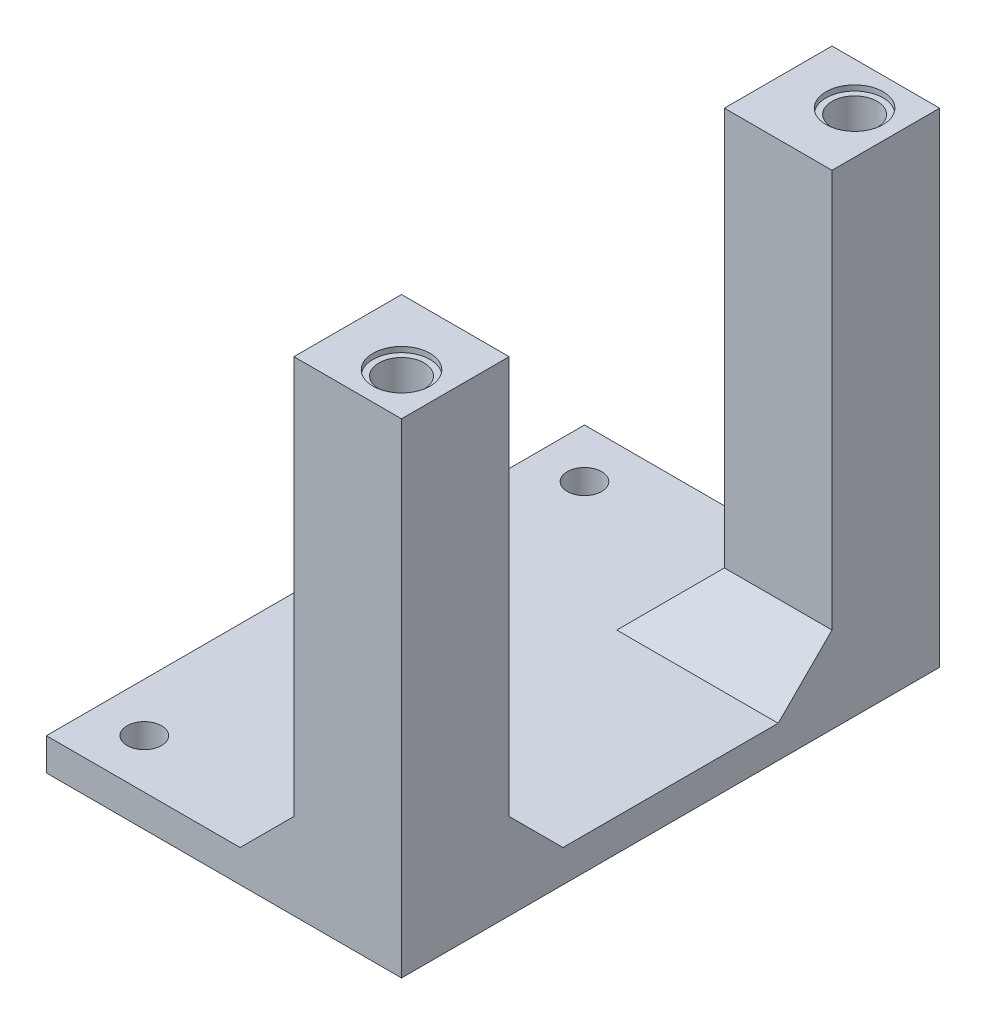
ISO-10303-21;
HEADER;
FILE_DESCRIPTION(('STEP AP214'),'2;1');
FILE_NAME('part.step','',(''),(''),'','','');
FILE_SCHEMA(('AUTOMOTIVE_DESIGN { 1 0 10303 214 1 1 1 1 }'));
ENDSEC;
DATA;
#1=APPLICATION_CONTEXT('core data for automotive mechanical design processes');
#2=APPLICATION_PROTOCOL_DEFINITION('international standard','automotive_design',2000,#1);
#3=PRODUCT_CONTEXT('',#1,'mechanical');
#4=PRODUCT('Part','Part','',(#3));
#5=PRODUCT_RELATED_PRODUCT_CATEGORY('part','',(#4));
#6=PRODUCT_DEFINITION_FORMATION('','',#4);
#7=PRODUCT_DEFINITION_CONTEXT('part definition',#1,'design');
#8=PRODUCT_DEFINITION('design','',#6,#7);
#9=PRODUCT_DEFINITION_SHAPE('','',#8);
#10=(LENGTH_UNIT() NAMED_UNIT(*) SI_UNIT(.MILLI.,.METRE.));
#11=(NAMED_UNIT(*) PLANE_ANGLE_UNIT() SI_UNIT($,.RADIAN.));
#12=(NAMED_UNIT(*) SI_UNIT($,.STERADIAN.) SOLID_ANGLE_UNIT());
#13=UNCERTAINTY_MEASURE_WITH_UNIT(LENGTH_MEASURE(1.E-05),#10,'distance_accuracy_value','');
#14=(GEOMETRIC_REPRESENTATION_CONTEXT(3) GLOBAL_UNCERTAINTY_ASSIGNED_CONTEXT((#13)) GLOBAL_UNIT_ASSIGNED_CONTEXT((#10,
#11,#12)) REPRESENTATION_CONTEXT('',''));
#15=CARTESIAN_POINT('',(0.,0.,0.));
#16=DIRECTION('',(0.,0.,1.));
#17=DIRECTION('',(1.,0.,0.));
#18=AXIS2_PLACEMENT_3D('',#15,#16,#17);
#19=CARTESIAN_POINT('',(22.5376033057851,-7.,-5.73595041322314));
#20=DIRECTION('',(0.,1.,0.));
#21=DIRECTION('',(0.,0.,1.));
#22=AXIS2_PLACEMENT_3D('',#19,#20,#21);
#23=CYLINDRICAL_SURFACE('',#22,2.1);
#24=CARTESIAN_POINT('',(22.5376033057851,44.5,-5.73595041322314));
#25=DIRECTION('',(0.,1.,0.));
#26=DIRECTION('',(0.,0.,1.));
#27=AXIS2_PLACEMENT_3D('',#24,#25,#26);
#28=CIRCLE('',#27,2.1);
#29=CARTESIAN_POINT('',(22.5376033057851,44.5,-3.63595041322314));
#30=VERTEX_POINT('',#29);
#31=EDGE_CURVE('E297',#30,#30,#28,.F.);
#32=ORIENTED_EDGE('',*,*,#31,.F.);
#33=EDGE_LOOP('',(#32));
#34=FACE_BOUND('',#33,.T.);
#35=CARTESIAN_POINT('',(22.5376033057851,0.5,-5.73595041322314));
#36=DIRECTION('',(0.,-1.,0.));
#37=DIRECTION('',(0.,0.,-1.));
#38=AXIS2_PLACEMENT_3D('',#35,#36,#37);
#39=CIRCLE('',#38,2.1);
#40=CARTESIAN_POINT('',(22.5376033057851,0.5,-7.83595041322314));
#41=VERTEX_POINT('',#40);
#42=EDGE_CURVE('E84',#41,#41,#39,.F.);
#43=ORIENTED_EDGE('',*,*,#42,.F.);
#44=EDGE_LOOP('',(#43));
#45=FACE_BOUND('',#44,.T.);
#46=ADVANCED_FACE('F79',(#34,#45),#23,.F.);
#47=CARTESIAN_POINT('',(22.5376033057851,-7.,36.3640495867769));
#48=DIRECTION('',(0.,1.,0.));
#49=DIRECTION('',(0.,0.,1.));
#50=AXIS2_PLACEMENT_3D('',#47,#48,#49);
#51=CYLINDRICAL_SURFACE('',#50,2.1);
#52=CARTESIAN_POINT('',(22.5376033057851,44.5,36.3640495867769));
#53=DIRECTION('',(0.,1.,0.));
#54=DIRECTION('',(0.,0.,1.));
#55=AXIS2_PLACEMENT_3D('',#52,#53,#54);
#56=CIRCLE('',#55,2.1);
#57=CARTESIAN_POINT('',(22.5376033057851,44.5,38.4640495867769));
#58=VERTEX_POINT('',#57);
#59=EDGE_CURVE('E298',#58,#58,#56,.F.);
#60=ORIENTED_EDGE('',*,*,#59,.F.);
#61=EDGE_LOOP('',(#60));
#62=FACE_BOUND('',#61,.T.);
#63=CARTESIAN_POINT('',(22.5376033057851,0.5,36.3640495867769));
#64=DIRECTION('',(0.,-1.,0.));
#65=DIRECTION('',(0.,0.,-1.));
#66=AXIS2_PLACEMENT_3D('',#63,#64,#65);
#67=CIRCLE('',#66,2.1);
#68=CARTESIAN_POINT('',(22.5376033057851,0.5,34.2640495867769));
#69=VERTEX_POINT('',#68);
#70=EDGE_CURVE('E303',#69,#69,#67,.F.);
#71=ORIENTED_EDGE('',*,*,#70,.F.);
#72=EDGE_LOOP('',(#71));
#73=FACE_BOUND('',#72,.T.);
#74=ADVANCED_FACE('F352',(#62,#73),#51,.F.);
#75=CARTESIAN_POINT('',(0.,3.,0.));
#76=DIRECTION('',(0.,-1.,0.));
#77=DIRECTION('',(0.,0.,-1.));
#78=AXIS2_PLACEMENT_3D('',#75,#76,#77);
#79=PLANE('',#78);
#80=CARTESIAN_POINT('',(-1.96239669421488,3.,-5.13595041322314));
#81=DIRECTION('',(0.,1.,0.));
#82=DIRECTION('',(0.,0.,1.));
#83=AXIS2_PLACEMENT_3D('',#80,#81,#82);
#84=CIRCLE('',#83,1.6);
#85=CARTESIAN_POINT('',(-1.96239669421488,3.,-3.53595041322314));
#86=VERTEX_POINT('',#85);
#87=EDGE_CURVE('E244',#86,#86,#84,.T.);
#88=ORIENTED_EDGE('',*,*,#87,.F.);
#89=EDGE_LOOP('',(#88));
#90=FACE_BOUND('',#89,.T.);
#91=CARTESIAN_POINT('',(-1.96239669421487,3.,35.7640495867769));
#92=DIRECTION('',(0.,1.,0.));
#93=DIRECTION('',(0.,0.,1.));
#94=AXIS2_PLACEMENT_3D('',#91,#92,#93);
#95=CIRCLE('',#94,1.6);
#96=CARTESIAN_POINT('',(-1.96239669421487,3.,37.3640495867769));
#97=VERTEX_POINT('',#96);
#98=EDGE_CURVE('E238',#97,#97,#95,.T.);
#99=ORIENTED_EDGE('',*,*,#98,.F.);
#100=EDGE_LOOP('',(#99));
#101=FACE_BOUND('',#100,.T.);
#102=DIRECTION('',(-1.,0.,0.));
#103=VECTOR('',#102,1.);
#104=CARTESIAN_POINT('',(16.4876033057851,3.,5.31404958677684));
#105=LINE('',#104,#103);
#106=CARTESIAN_POINT('',(26.4876033057851,3.,5.31404958677684));
#107=VERTEX_POINT('',#106);
#108=CARTESIAN_POINT('',(11.4876033057851,3.,5.31404958677685));
#109=VERTEX_POINT('',#108);
#110=EDGE_CURVE('E280',#107,#109,#105,.T.);
#111=ORIENTED_EDGE('',*,*,#110,.T.);
#112=DIRECTION('',(0.,0.,-1.));
#113=VECTOR('',#112,1.);
#114=CARTESIAN_POINT('',(11.4876033057851,3.,-9.68595041322314));
#115=LINE('',#114,#113);
#116=CARTESIAN_POINT('',(11.4876033057851,3.,-9.68595041322314));
#117=VERTEX_POINT('',#116);
#118=EDGE_CURVE('E282',#109,#117,#115,.T.);
#119=ORIENTED_EDGE('',*,*,#118,.T.);
#120=DIRECTION('',(1.,0.,0.));
#121=VECTOR('',#120,1.);
#122=CARTESIAN_POINT('',(-6.51239669421488,3.,-9.68595041322314));
#123=LINE('',#122,#121);
#124=CARTESIAN_POINT('',(-6.51239669421488,3.,-9.68595041322314));
#125=VERTEX_POINT('',#124);
#126=EDGE_CURVE('E250',#125,#117,#123,.T.);
#127=ORIENTED_EDGE('',*,*,#126,.F.);
#128=DIRECTION('',(0.,0.,1.));
#129=VECTOR('',#128,1.);
#130=CARTESIAN_POINT('',(-6.51239669421488,3.,-9.68595041322314));
#131=LINE('',#130,#129);
#132=CARTESIAN_POINT('',(-6.51239669421487,3.,40.3140495867769));
#133=VERTEX_POINT('',#132);
#134=EDGE_CURVE('E189',#125,#133,#131,.T.);
#135=ORIENTED_EDGE('',*,*,#134,.T.);
#136=DIRECTION('',(1.,0.,0.));
#137=VECTOR('',#136,1.);
#138=CARTESIAN_POINT('',(1.48760330578513,3.,40.3140495867769));
#139=LINE('',#138,#137);
#140=CARTESIAN_POINT('',(11.4876033057852,3.,40.3140495867769));
#141=VERTEX_POINT('',#140);
#142=EDGE_CURVE('E256',#133,#141,#139,.T.);
#143=ORIENTED_EDGE('',*,*,#142,.T.);
#144=DIRECTION('',(0.,0.,-1.));
#145=VECTOR('',#144,1.);
#146=CARTESIAN_POINT('',(11.4876033057852,3.,30.3140495867769));
#147=LINE('',#146,#145);
#148=CARTESIAN_POINT('',(11.4876033057852,3.,25.3140495867769));
#149=VERTEX_POINT('',#148);
#150=EDGE_CURVE('E278',#141,#149,#147,.T.);
#151=ORIENTED_EDGE('',*,*,#150,.T.);
#152=DIRECTION('',(1.,0.,0.));
#153=VECTOR('',#152,1.);
#154=CARTESIAN_POINT('',(26.4876033057851,3.,25.3140495867769));
#155=LINE('',#154,#153);
#156=CARTESIAN_POINT('',(26.4876033057851,3.,25.3140495867769));
#157=VERTEX_POINT('',#156);
#158=EDGE_CURVE('E276',#149,#157,#155,.T.);
#159=ORIENTED_EDGE('',*,*,#158,.T.);
#160=DIRECTION('',(0.,0.,1.));
#161=VECTOR('',#160,1.);
#162=CARTESIAN_POINT('',(26.4876033057851,3.,-9.68595041322314));
#163=LINE('',#162,#161);
#164=EDGE_CURVE('E253',#107,#157,#163,.T.);
#165=ORIENTED_EDGE('',*,*,#164,.F.);
#166=EDGE_LOOP('',(#111,#119,#127,#135,#143,#151,#159,#165));
#167=FACE_BOUND('',#166,.T.);
#168=ADVANCED_FACE('F357',(#90,#101,#167),#79,.F.);
#169=CARTESIAN_POINT('',(0.,0.,0.));
#170=DIRECTION('',(0.,-1.,0.));
#171=DIRECTION('',(0.,0.,-1.));
#172=AXIS2_PLACEMENT_3D('',#169,#170,#171);
#173=PLANE('',#172);
#174=CARTESIAN_POINT('',(22.5376033057851,0.,36.3640495867769));
#175=DIRECTION('',(0.,1.,0.));
#176=DIRECTION('',(0.,0.,1.));
#177=AXIS2_PLACEMENT_3D('',#174,#175,#176);
#178=CIRCLE('',#177,2.65);
#179=CARTESIAN_POINT('',(22.5376033057851,0.,39.0140495867769));
#180=VERTEX_POINT('',#179);
#181=EDGE_CURVE('E310',#180,#180,#178,.T.);
#182=ORIENTED_EDGE('',*,*,#181,.T.);
#183=EDGE_LOOP('',(#182));
#184=FACE_BOUND('',#183,.T.);
#185=CARTESIAN_POINT('',(22.5376033057851,0.,-5.73595041322314));
#186=DIRECTION('',(0.,1.,0.));
#187=DIRECTION('',(0.,0.,1.));
#188=AXIS2_PLACEMENT_3D('',#185,#186,#187);
#189=CIRCLE('',#188,2.65);
#190=CARTESIAN_POINT('',(22.5376033057851,0.,-3.08595041322314));
#191=VERTEX_POINT('',#190);
#192=EDGE_CURVE('E320',#191,#191,#189,.T.);
#193=ORIENTED_EDGE('',*,*,#192,.T.);
#194=EDGE_LOOP('',(#193));
#195=FACE_BOUND('',#194,.T.);
#196=CARTESIAN_POINT('',(-1.96239669421488,0.,-5.13595041322314));
#197=DIRECTION('',(0.,1.,0.));
#198=DIRECTION('',(0.,0.,1.));
#199=AXIS2_PLACEMENT_3D('',#196,#197,#198);
#200=CIRCLE('',#199,1.6);
#201=CARTESIAN_POINT('',(-1.96239669421488,0.,-3.53595041322314));
#202=VERTEX_POINT('',#201);
#203=EDGE_CURVE('E241',#202,#202,#200,.T.);
#204=ORIENTED_EDGE('',*,*,#203,.T.);
#205=EDGE_LOOP('',(#204));
#206=FACE_BOUND('',#205,.T.);
#207=DIRECTION('',(0.,0.,1.));
#208=VECTOR('',#207,1.);
#209=CARTESIAN_POINT('',(-6.51239669421488,0.,-9.68595041322314));
#210=LINE('',#209,#208);
#211=CARTESIAN_POINT('',(-6.51239669421488,0.,-9.68595041322314));
#212=VERTEX_POINT('',#211);
#213=CARTESIAN_POINT('',(-6.51239669421487,0.,40.3140495867769));
#214=VERTEX_POINT('',#213);
#215=EDGE_CURVE('E254',#212,#214,#210,.T.);
#216=ORIENTED_EDGE('',*,*,#215,.F.);
#217=DIRECTION('',(1.,0.,0.));
#218=VECTOR('',#217,1.);
#219=CARTESIAN_POINT('',(1.48760330578512,0.,-9.68595041322314));
#220=LINE('',#219,#218);
#221=CARTESIAN_POINT('',(26.4876033057851,0.,-9.68595041322314));
#222=VERTEX_POINT('',#221);
#223=EDGE_CURVE('E247',#212,#222,#220,.T.);
#224=ORIENTED_EDGE('',*,*,#223,.T.);
#225=DIRECTION('',(0.,0.,1.));
#226=VECTOR('',#225,1.);
#227=CARTESIAN_POINT('',(26.4876033057851,0.,-9.68595041322314));
#228=LINE('',#227,#226);
#229=CARTESIAN_POINT('',(26.4876033057851,0.,40.3140495867769));
#230=VERTEX_POINT('',#229);
#231=EDGE_CURVE('E185',#222,#230,#228,.T.);
#232=ORIENTED_EDGE('',*,*,#231,.T.);
#233=DIRECTION('',(1.,0.,0.));
#234=VECTOR('',#233,1.);
#235=CARTESIAN_POINT('',(-6.51239669421487,0.,40.3140495867769));
#236=LINE('',#235,#234);
#237=EDGE_CURVE('E263',#214,#230,#236,.T.);
#238=ORIENTED_EDGE('',*,*,#237,.F.);
#239=EDGE_LOOP('',(#216,#224,#232,#238));
#240=FACE_BOUND('',#239,.T.);
#241=CARTESIAN_POINT('',(-1.96239669421487,0.,35.7640495867769));
#242=DIRECTION('',(0.,1.,0.));
#243=DIRECTION('',(0.,0.,1.));
#244=AXIS2_PLACEMENT_3D('',#241,#242,#243);
#245=CIRCLE('',#244,1.6);
#246=CARTESIAN_POINT('',(-1.96239669421487,0.,37.3640495867769));
#247=VERTEX_POINT('',#246);
#248=EDGE_CURVE('E237',#247,#247,#245,.T.);
#249=ORIENTED_EDGE('',*,*,#248,.T.);
#250=EDGE_LOOP('',(#249));
#251=FACE_BOUND('',#250,.T.);
#252=ADVANCED_FACE('F559',(#184,#195,#206,#240,#251),#173,.T.);
#253=CARTESIAN_POINT('',(-6.51239669421488,3.,-9.68595041322314));
#254=DIRECTION('',(1.,0.,0.));
#255=DIRECTION('',(0.,0.,-1.));
#256=AXIS2_PLACEMENT_3D('',#253,#254,#255);
#257=PLANE('',#256);
#258=ORIENTED_EDGE('',*,*,#215,.T.);
#259=DIRECTION('',(0.,-1.,0.));
#260=VECTOR('',#259,1.);
#261=CARTESIAN_POINT('',(-6.51239669421487,3.,40.3140495867769));
#262=LINE('',#261,#260);
#263=EDGE_CURVE('E270',#133,#214,#262,.T.);
#264=ORIENTED_EDGE('',*,*,#263,.F.);
#265=ORIENTED_EDGE('',*,*,#134,.F.);
#266=DIRECTION('',(0.,-1.,0.));
#267=VECTOR('',#266,1.);
#268=CARTESIAN_POINT('',(-6.51239669421488,3.,-9.68595041322314));
#269=LINE('',#268,#267);
#270=EDGE_CURVE('E266',#125,#212,#269,.T.);
#271=ORIENTED_EDGE('',*,*,#270,.T.);
#272=EDGE_LOOP('',(#258,#264,#265,#271));
#273=FACE_BOUND('',#272,.T.);
#274=ADVANCED_FACE('F547',(#273),#257,.F.);
#275=CARTESIAN_POINT('',(-6.51239669421487,3.,40.3140495867769));
#276=DIRECTION('',(0.,0.,-1.));
#277=DIRECTION('',(-1.,0.,0.));
#278=AXIS2_PLACEMENT_3D('',#275,#276,#277);
#279=PLANE('',#278);
#280=ORIENTED_EDGE('',*,*,#237,.T.);
#281=DIRECTION('',(0.,-1.,0.));
#282=VECTOR('',#281,1.);
#283=CARTESIAN_POINT('',(26.4876033057851,3.,40.3140495867769));
#284=LINE('',#283,#282);
#285=CARTESIAN_POINT('',(26.4876033057851,45.,40.3140495867769));
#286=VERTEX_POINT('',#285);
#287=EDGE_CURVE('E188',#286,#230,#284,.T.);
#288=ORIENTED_EDGE('',*,*,#287,.F.);
#289=DIRECTION('',(1.,0.,0.));
#290=VECTOR('',#289,1.);
#291=CARTESIAN_POINT('',(26.4876033057851,45.,40.3140495867769));
#292=LINE('',#291,#290);
#293=CARTESIAN_POINT('',(16.4876033057851,45.,40.3140495867769));
#294=VERTEX_POINT('',#293);
#295=EDGE_CURVE('E227',#294,#286,#292,.T.);
#296=ORIENTED_EDGE('',*,*,#295,.F.);
#297=DIRECTION('',(0.,-1.,0.));
#298=VECTOR('',#297,1.);
#299=CARTESIAN_POINT('',(16.4876033057851,45.,40.3140495867769));
#300=LINE('',#299,#298);
#301=CARTESIAN_POINT('',(16.4876033057851,8.00000000000004,40.3140495867769));
#302=VERTEX_POINT('',#301);
#303=EDGE_CURVE('E230',#294,#302,#300,.T.);
#304=ORIENTED_EDGE('',*,*,#303,.T.);
#305=DIRECTION('',(0.707106781186544,0.707106781186551,0.));
#306=VECTOR('',#305,1.);
#307=CARTESIAN_POINT('',(2.48760330578524,-6.00000000000001,40.3140495867769));
#308=LINE('',#307,#306);
#309=EDGE_CURVE('E89',#302,#141,#308,.F.);
#310=ORIENTED_EDGE('',*,*,#309,.T.);
#311=ORIENTED_EDGE('',*,*,#142,.F.);
#312=ORIENTED_EDGE('',*,*,#263,.T.);
#313=EDGE_LOOP('',(#280,#288,#296,#304,#310,#311,#312));
#314=FACE_BOUND('',#313,.T.);
#315=ADVANCED_FACE('F535',(#314),#279,.F.);
#316=CARTESIAN_POINT('',(26.4876033057851,3.,-9.68595041322314));
#317=DIRECTION('',(1.,0.,0.));
#318=DIRECTION('',(0.,0.,-1.));
#319=AXIS2_PLACEMENT_3D('',#316,#317,#318);
#320=PLANE('',#319);
#321=ORIENTED_EDGE('',*,*,#231,.F.);
#322=DIRECTION('',(0.,-1.,0.));
#323=VECTOR('',#322,1.);
#324=CARTESIAN_POINT('',(26.4876033057851,3.,-9.68595041322314));
#325=LINE('',#324,#323);
#326=CARTESIAN_POINT('',(26.4876033057851,45.,-9.68595041322314));
#327=VERTEX_POINT('',#326);
#328=EDGE_CURVE('E177',#327,#222,#325,.T.);
#329=ORIENTED_EDGE('',*,*,#328,.F.);
#330=DIRECTION('',(0.,0.,-1.));
#331=VECTOR('',#330,1.);
#332=CARTESIAN_POINT('',(26.4876033057851,45.,-9.68595041322314));
#333=LINE('',#332,#331);
#334=CARTESIAN_POINT('',(26.4876033057851,45.,0.314049586776862));
#335=VERTEX_POINT('',#334);
#336=EDGE_CURVE('E182',#335,#327,#333,.T.);
#337=ORIENTED_EDGE('',*,*,#336,.F.);
#338=DIRECTION('',(0.,-1.,0.));
#339=VECTOR('',#338,1.);
#340=CARTESIAN_POINT('',(26.4876033057851,45.,0.314049586776862));
#341=LINE('',#340,#339);
#342=CARTESIAN_POINT('',(26.4876033057851,8.00000000000006,0.314049586776862));
#343=VERTEX_POINT('',#342);
#344=EDGE_CURVE('E214',#335,#343,#341,.T.);
#345=ORIENTED_EDGE('',*,*,#344,.T.);
#346=DIRECTION('',(0.,0.707106781186552,-0.707106781186543));
#347=VECTOR('',#346,1.);
#348=CARTESIAN_POINT('',(26.4876033057851,8.00000000000004,0.314049586776862));
#349=LINE('',#348,#347);
#350=EDGE_CURVE('E292',#343,#107,#349,.F.);
#351=ORIENTED_EDGE('',*,*,#350,.T.);
#352=ORIENTED_EDGE('',*,*,#164,.T.);
#353=DIRECTION('',(0.,-0.707106781186551,-0.707106781186544));
#354=VECTOR('',#353,1.);
#355=CARTESIAN_POINT('',(26.4876033057851,8.00000000000003,30.3140495867769));
#356=LINE('',#355,#354);
#357=CARTESIAN_POINT('',(26.4876033057851,8.00000000000004,30.3140495867769));
#358=VERTEX_POINT('',#357);
#359=EDGE_CURVE('E12',#157,#358,#356,.F.);
#360=ORIENTED_EDGE('',*,*,#359,.T.);
#361=DIRECTION('',(0.,-1.,0.));
#362=VECTOR('',#361,1.);
#363=CARTESIAN_POINT('',(26.4876033057851,45.,30.3140495867769));
#364=LINE('',#363,#362);
#365=CARTESIAN_POINT('',(26.4876033057851,45.,30.3140495867769));
#366=VERTEX_POINT('',#365);
#367=EDGE_CURVE('E235',#366,#358,#364,.T.);
#368=ORIENTED_EDGE('',*,*,#367,.F.);
#369=DIRECTION('',(0.,0.,-1.));
#370=VECTOR('',#369,1.);
#371=CARTESIAN_POINT('',(26.4876033057851,45.,40.3140495867769));
#372=LINE('',#371,#370);
#373=EDGE_CURVE('E220',#286,#366,#372,.T.);
#374=ORIENTED_EDGE('',*,*,#373,.F.);
#375=ORIENTED_EDGE('',*,*,#287,.T.);
#376=EDGE_LOOP('',(#321,#329,#337,#345,#351,#352,#360,#368,#374,#375));
#377=FACE_BOUND('',#376,.T.);
#378=ADVANCED_FACE('F179',(#377),#320,.T.);
#379=CARTESIAN_POINT('',(1.48760330578512,3.,-9.68595041322314));
#380=DIRECTION('',(0.,0.,-1.));
#381=DIRECTION('',(-1.,0.,0.));
#382=AXIS2_PLACEMENT_3D('',#379,#380,#381);
#383=PLANE('',#382);
#384=ORIENTED_EDGE('',*,*,#223,.F.);
#385=ORIENTED_EDGE('',*,*,#270,.F.);
#386=ORIENTED_EDGE('',*,*,#126,.T.);
#387=DIRECTION('',(-0.707106781186543,-0.707106781186552,0.));
#388=VECTOR('',#387,1.);
#389=CARTESIAN_POINT('',(16.4876033057851,8.00000000000004,-9.68595041322314));
#390=LINE('',#389,#388);
#391=CARTESIAN_POINT('',(16.4876033057851,8.00000000000006,-9.68595041322314));
#392=VERTEX_POINT('',#391);
#393=EDGE_CURVE('E290',#117,#392,#390,.F.);
#394=ORIENTED_EDGE('',*,*,#393,.T.);
#395=DIRECTION('',(0.,-1.,0.));
#396=VECTOR('',#395,1.);
#397=CARTESIAN_POINT('',(16.4876033057851,45.,-9.68595041322314));
#398=LINE('',#397,#396);
#399=CARTESIAN_POINT('',(16.4876033057851,45.,-9.68595041322314));
#400=VERTEX_POINT('',#399);
#401=EDGE_CURVE('E195',#400,#392,#398,.T.);
#402=ORIENTED_EDGE('',*,*,#401,.F.);
#403=DIRECTION('',(-1.,0.,0.));
#404=VECTOR('',#403,1.);
#405=CARTESIAN_POINT('',(26.4876033057851,45.,-9.68595041322314));
#406=LINE('',#405,#404);
#407=EDGE_CURVE('E192',#327,#400,#406,.T.);
#408=ORIENTED_EDGE('',*,*,#407,.F.);
#409=ORIENTED_EDGE('',*,*,#328,.T.);
#410=EDGE_LOOP('',(#384,#385,#386,#394,#402,#408,#409));
#411=FACE_BOUND('',#410,.T.);
#412=ADVANCED_FACE('F193',(#411),#383,.T.);
#413=CARTESIAN_POINT('',(-1.96239669421488,3.,-5.13595041322314));
#414=DIRECTION('',(0.,-1.,0.));
#415=DIRECTION('',(0.,0.,-1.));
#416=AXIS2_PLACEMENT_3D('',#413,#414,#415);
#417=CYLINDRICAL_SURFACE('',#416,1.6);
#418=ORIENTED_EDGE('',*,*,#87,.T.);
#419=EDGE_LOOP('',(#418));
#420=FACE_BOUND('',#419,.T.);
#421=ORIENTED_EDGE('',*,*,#203,.F.);
#422=EDGE_LOOP('',(#421));
#423=FACE_BOUND('',#422,.T.);
#424=ADVANCED_FACE('F523',(#420,#423),#417,.F.);
#425=CARTESIAN_POINT('',(-1.96239669421487,3.,35.7640495867769));
#426=DIRECTION('',(0.,-1.,0.));
#427=DIRECTION('',(0.,0.,-1.));
#428=AXIS2_PLACEMENT_3D('',#425,#426,#427);
#429=CYLINDRICAL_SURFACE('',#428,1.6);
#430=ORIENTED_EDGE('',*,*,#98,.T.);
#431=EDGE_LOOP('',(#430));
#432=FACE_BOUND('',#431,.T.);
#433=ORIENTED_EDGE('',*,*,#248,.F.);
#434=EDGE_LOOP('',(#433));
#435=FACE_BOUND('',#434,.T.);
#436=ADVANCED_FACE('F514',(#432,#435),#429,.F.);
#437=CARTESIAN_POINT('',(26.4876033057851,45.,30.3140495867769));
#438=DIRECTION('',(0.,0.,1.));
#439=DIRECTION('',(1.,0.,0.));
#440=AXIS2_PLACEMENT_3D('',#437,#438,#439);
#441=PLANE('',#440);
#442=ORIENTED_EDGE('',*,*,#367,.T.);
#443=DIRECTION('',(-1.,0.,0.));
#444=VECTOR('',#443,1.);
#445=CARTESIAN_POINT('',(16.4876033057851,8.00000000000003,30.3140495867769));
#446=LINE('',#445,#444);
#447=CARTESIAN_POINT('',(16.4876033057851,8.00000000000004,30.3140495867769));
#448=VERTEX_POINT('',#447);
#449=EDGE_CURVE('E102',#358,#448,#446,.T.);
#450=ORIENTED_EDGE('',*,*,#449,.T.);
#451=DIRECTION('',(0.,-1.,0.));
#452=VECTOR('',#451,1.);
#453=CARTESIAN_POINT('',(16.4876033057851,45.,30.3140495867769));
#454=LINE('',#453,#452);
#455=CARTESIAN_POINT('',(16.4876033057851,45.,30.3140495867769));
#456=VERTEX_POINT('',#455);
#457=EDGE_CURVE('E233',#456,#448,#454,.T.);
#458=ORIENTED_EDGE('',*,*,#457,.F.);
#459=DIRECTION('',(-1.,0.,0.));
#460=VECTOR('',#459,1.);
#461=CARTESIAN_POINT('',(26.4876033057851,45.,30.3140495867769));
#462=LINE('',#461,#460);
#463=EDGE_CURVE('E223',#366,#456,#462,.T.);
#464=ORIENTED_EDGE('',*,*,#463,.F.);
#465=EDGE_LOOP('',(#442,#450,#458,#464));
#466=FACE_BOUND('',#465,.T.);
#467=ADVANCED_FACE('F505',(#466),#441,.F.);
#468=CARTESIAN_POINT('',(16.4876033057851,45.,40.3140495867769));
#469=DIRECTION('',(1.,0.,0.));
#470=DIRECTION('',(0.,0.,-1.));
#471=AXIS2_PLACEMENT_3D('',#468,#469,#470);
#472=PLANE('',#471);
#473=ORIENTED_EDGE('',*,*,#457,.T.);
#474=DIRECTION('',(0.,0.,1.));
#475=VECTOR('',#474,1.);
#476=CARTESIAN_POINT('',(16.4876033057851,8.00000000000003,40.3140495867769));
#477=LINE('',#476,#475);
#478=EDGE_CURVE('E286',#448,#302,#477,.T.);
#479=ORIENTED_EDGE('',*,*,#478,.T.);
#480=ORIENTED_EDGE('',*,*,#303,.F.);
#481=DIRECTION('',(0.,0.,1.));
#482=VECTOR('',#481,1.);
#483=CARTESIAN_POINT('',(16.4876033057851,45.,40.3140495867769));
#484=LINE('',#483,#482);
#485=EDGE_CURVE('E225',#456,#294,#484,.T.);
#486=ORIENTED_EDGE('',*,*,#485,.F.);
#487=EDGE_LOOP('',(#473,#479,#480,#486));
#488=FACE_BOUND('',#487,.T.);
#489=ADVANCED_FACE('F497',(#488),#472,.F.);
#490=CARTESIAN_POINT('',(0.,45.,0.));
#491=DIRECTION('',(0.,1.,0.));
#492=DIRECTION('',(0.,0.,1.));
#493=AXIS2_PLACEMENT_3D('',#490,#491,#492);
#494=PLANE('',#493);
#495=CARTESIAN_POINT('',(22.5376033057851,45.,36.3640495867769));
#496=DIRECTION('',(0.,1.,0.));
#497=DIRECTION('',(0.,0.,1.));
#498=AXIS2_PLACEMENT_3D('',#495,#496,#497);
#499=CIRCLE('',#498,2.65);
#500=CARTESIAN_POINT('',(22.5376033057851,45.,39.0140495867769));
#501=VERTEX_POINT('',#500);
#502=EDGE_CURVE('E325',#501,#501,#499,.T.);
#503=ORIENTED_EDGE('',*,*,#502,.F.);
#504=EDGE_LOOP('',(#503));
#505=FACE_BOUND('',#504,.T.);
#506=ORIENTED_EDGE('',*,*,#373,.T.);
#507=ORIENTED_EDGE('',*,*,#463,.T.);
#508=ORIENTED_EDGE('',*,*,#485,.T.);
#509=ORIENTED_EDGE('',*,*,#295,.T.);
#510=EDGE_LOOP('',(#506,#507,#508,#509));
#511=FACE_BOUND('',#510,.T.);
#512=ADVANCED_FACE('F488',(#505,#511),#494,.T.);
#513=CARTESIAN_POINT('',(16.4876033057851,45.,-9.68595041322314));
#514=DIRECTION('',(1.,0.,0.));
#515=DIRECTION('',(0.,0.,-1.));
#516=AXIS2_PLACEMENT_3D('',#513,#514,#515);
#517=PLANE('',#516);
#518=ORIENTED_EDGE('',*,*,#401,.T.);
#519=DIRECTION('',(0.,0.,1.));
#520=VECTOR('',#519,1.);
#521=CARTESIAN_POINT('',(16.4876033057851,8.00000000000004,0.314049586776863));
#522=LINE('',#521,#520);
#523=CARTESIAN_POINT('',(16.4876033057851,8.00000000000006,0.314049586776863));
#524=VERTEX_POINT('',#523);
#525=EDGE_CURVE('E269',#392,#524,#522,.T.);
#526=ORIENTED_EDGE('',*,*,#525,.T.);
#527=DIRECTION('',(0.,-1.,0.));
#528=VECTOR('',#527,1.);
#529=CARTESIAN_POINT('',(16.4876033057851,45.,0.314049586776863));
#530=LINE('',#529,#528);
#531=CARTESIAN_POINT('',(16.4876033057851,45.,0.314049586776863));
#532=VERTEX_POINT('',#531);
#533=EDGE_CURVE('E216',#532,#524,#530,.T.);
#534=ORIENTED_EDGE('',*,*,#533,.F.);
#535=DIRECTION('',(0.,0.,1.));
#536=VECTOR('',#535,1.);
#537=CARTESIAN_POINT('',(16.4876033057851,45.,-9.68595041322314));
#538=LINE('',#537,#536);
#539=EDGE_CURVE('E198',#400,#532,#538,.T.);
#540=ORIENTED_EDGE('',*,*,#539,.F.);
#541=EDGE_LOOP('',(#518,#526,#534,#540));
#542=FACE_BOUND('',#541,.T.);
#543=ADVANCED_FACE('F347',(#542),#517,.F.);
#544=CARTESIAN_POINT('',(26.4876033057851,45.,0.314049586776862));
#545=DIRECTION('',(0.,0.,-1.));
#546=DIRECTION('',(-1.,0.,0.));
#547=AXIS2_PLACEMENT_3D('',#544,#545,#546);
#548=PLANE('',#547);
#549=ORIENTED_EDGE('',*,*,#533,.T.);
#550=DIRECTION('',(1.,0.,0.));
#551=VECTOR('',#550,1.);
#552=CARTESIAN_POINT('',(26.4876033057851,8.00000000000004,0.314049586776862));
#553=LINE('',#552,#551);
#554=EDGE_CURVE('E284',#524,#343,#553,.T.);
#555=ORIENTED_EDGE('',*,*,#554,.T.);
#556=ORIENTED_EDGE('',*,*,#344,.F.);
#557=DIRECTION('',(1.,0.,0.));
#558=VECTOR('',#557,1.);
#559=CARTESIAN_POINT('',(26.4876033057851,45.,0.314049586776862));
#560=LINE('',#559,#558);
#561=EDGE_CURVE('E202',#532,#335,#560,.T.);
#562=ORIENTED_EDGE('',*,*,#561,.F.);
#563=EDGE_LOOP('',(#549,#555,#556,#562));
#564=FACE_BOUND('',#563,.T.);
#565=ADVANCED_FACE('F338',(#564),#548,.F.);
#566=CARTESIAN_POINT('',(0.,45.,0.));
#567=DIRECTION('',(0.,-1.,0.));
#568=DIRECTION('',(0.,0.,-1.));
#569=AXIS2_PLACEMENT_3D('',#566,#567,#568);
#570=PLANE('',#569);
#571=CARTESIAN_POINT('',(22.5376033057851,45.,-5.73595041322314));
#572=DIRECTION('',(0.,1.,0.));
#573=DIRECTION('',(0.,0.,1.));
#574=AXIS2_PLACEMENT_3D('',#571,#572,#573);
#575=CIRCLE('',#574,2.65);
#576=CARTESIAN_POINT('',(22.5376033057851,45.,-3.08595041322314));
#577=VERTEX_POINT('',#576);
#578=EDGE_CURVE('E209',#577,#577,#575,.T.);
#579=ORIENTED_EDGE('',*,*,#578,.F.);
#580=EDGE_LOOP('',(#579));
#581=FACE_BOUND('',#580,.T.);
#582=ORIENTED_EDGE('',*,*,#336,.T.);
#583=ORIENTED_EDGE('',*,*,#407,.T.);
#584=ORIENTED_EDGE('',*,*,#539,.T.);
#585=ORIENTED_EDGE('',*,*,#561,.T.);
#586=EDGE_LOOP('',(#582,#583,#584,#585));
#587=FACE_BOUND('',#586,.T.);
#588=ADVANCED_FACE('F200',(#581,#587),#570,.F.);
#589=CARTESIAN_POINT('',(26.4876033057851,8.00000000000004,0.314049586776862));
#590=DIRECTION('',(0.,0.707106781186543,0.707106781186552));
#591=DIRECTION('',(-1.,0.,0.));
#592=AXIS2_PLACEMENT_3D('',#589,#590,#591);
#593=PLANE('',#592);
#594=ORIENTED_EDGE('',*,*,#350,.F.);
#595=ORIENTED_EDGE('',*,*,#554,.F.);
#596=DIRECTION('',(-0.577350269189624,-0.57735026918963,0.577350269189623));
#597=VECTOR('',#596,1.);
#598=CARTESIAN_POINT('',(19.8209366391184,11.3333333333334,-3.01928374655645));
#599=LINE('',#598,#597);
#600=EDGE_CURVE('E204',#109,#524,#599,.F.);
#601=ORIENTED_EDGE('',*,*,#600,.F.);
#602=ORIENTED_EDGE('',*,*,#110,.F.);
#603=EDGE_LOOP('',(#594,#595,#601,#602));
#604=FACE_BOUND('',#603,.T.);
#605=ADVANCED_FACE('F337',(#604),#593,.T.);
#606=CARTESIAN_POINT('',(16.4876033057851,8.00000000000004,-9.68595041322314));
#607=DIRECTION('',(-0.707106781186552,0.707106781186543,0.));
#608=DIRECTION('',(0.,0.,-1.));
#609=AXIS2_PLACEMENT_3D('',#606,#607,#608);
#610=PLANE('',#609);
#611=ORIENTED_EDGE('',*,*,#393,.F.);
#612=ORIENTED_EDGE('',*,*,#118,.F.);
#613=ORIENTED_EDGE('',*,*,#600,.T.);
#614=ORIENTED_EDGE('',*,*,#525,.F.);
#615=EDGE_LOOP('',(#611,#612,#613,#614));
#616=FACE_BOUND('',#615,.T.);
#617=ADVANCED_FACE('F344',(#616),#610,.T.);
#618=CARTESIAN_POINT('',(26.4876033057851,8.00000000000003,30.3140495867769));
#619=DIRECTION('',(0.,0.707106781186544,-0.707106781186551));
#620=DIRECTION('',(1.,0.,0.));
#621=AXIS2_PLACEMENT_3D('',#618,#619,#620);
#622=PLANE('',#621);
#623=ORIENTED_EDGE('',*,*,#359,.F.);
#624=ORIENTED_EDGE('',*,*,#158,.F.);
#625=DIRECTION('',(0.577350269189624,0.57735026918963,0.577350269189624));
#626=VECTOR('',#625,1.);
#627=CARTESIAN_POINT('',(19.8209366391184,11.3333333333334,33.6473829201102));
#628=LINE('',#627,#626);
#629=EDGE_CURVE('E206',#448,#149,#628,.F.);
#630=ORIENTED_EDGE('',*,*,#629,.F.);
#631=ORIENTED_EDGE('',*,*,#449,.F.);
#632=EDGE_LOOP('',(#623,#624,#630,#631));
#633=FACE_BOUND('',#632,.T.);
#634=ADVANCED_FACE('F82',(#633),#622,.T.);
#635=CARTESIAN_POINT('',(16.4876033057851,8.00000000000003,40.3140495867769));
#636=DIRECTION('',(-0.707106781186551,0.707106781186544,0.));
#637=DIRECTION('',(0.,0.,-1.));
#638=AXIS2_PLACEMENT_3D('',#635,#636,#637);
#639=PLANE('',#638);
#640=ORIENTED_EDGE('',*,*,#629,.T.);
#641=ORIENTED_EDGE('',*,*,#150,.F.);
#642=ORIENTED_EDGE('',*,*,#309,.F.);
#643=ORIENTED_EDGE('',*,*,#478,.F.);
#644=EDGE_LOOP('',(#640,#641,#642,#643));
#645=FACE_BOUND('',#644,.T.);
#646=ADVANCED_FACE('F377',(#645),#639,.T.);
#647=CARTESIAN_POINT('',(22.5376033057851,44.5,36.3640495867769));
#648=DIRECTION('',(0.,1.,0.));
#649=DIRECTION('',(0.,0.,1.));
#650=AXIS2_PLACEMENT_3D('',#647,#648,#649);
#651=PLANE('',#650);
#652=CARTESIAN_POINT('',(22.5376033057851,44.5,36.3640495867769));
#653=DIRECTION('',(0.,1.,0.));
#654=DIRECTION('',(0.,0.,1.));
#655=AXIS2_PLACEMENT_3D('',#652,#653,#654);
#656=CIRCLE('',#655,2.65);
#657=CARTESIAN_POINT('',(22.5376033057851,44.5,39.0140495867769));
#658=VERTEX_POINT('',#657);
#659=EDGE_CURVE('E301',#658,#658,#656,.T.);
#660=ORIENTED_EDGE('',*,*,#659,.T.);
#661=EDGE_LOOP('',(#660));
#662=FACE_BOUND('',#661,.T.);
#663=ORIENTED_EDGE('',*,*,#59,.T.);
#664=EDGE_LOOP('',(#663));
#665=FACE_BOUND('',#664,.T.);
#666=ADVANCED_FACE('F373',(#662,#665),#651,.T.);
#667=CARTESIAN_POINT('',(22.5376033057851,44.5,36.3640495867769));
#668=DIRECTION('',(0.,1.,0.));
#669=DIRECTION('',(0.,0.,1.));
#670=AXIS2_PLACEMENT_3D('',#667,#668,#669);
#671=CYLINDRICAL_SURFACE('',#670,2.65);
#672=ORIENTED_EDGE('',*,*,#659,.F.);
#673=EDGE_LOOP('',(#672));
#674=FACE_BOUND('',#673,.T.);
#675=ORIENTED_EDGE('',*,*,#502,.T.);
#676=EDGE_LOOP('',(#675));
#677=FACE_BOUND('',#676,.T.);
#678=ADVANCED_FACE('F370',(#674,#677),#671,.F.);
#679=CARTESIAN_POINT('',(22.5376033057851,44.5,-5.73595041322314));
#680=DIRECTION('',(0.,1.,0.));
#681=DIRECTION('',(0.,0.,1.));
#682=AXIS2_PLACEMENT_3D('',#679,#680,#681);
#683=PLANE('',#682);
#684=CARTESIAN_POINT('',(22.5376033057851,44.5,-5.73595041322314));
#685=DIRECTION('',(0.,1.,0.));
#686=DIRECTION('',(0.,0.,1.));
#687=AXIS2_PLACEMENT_3D('',#684,#685,#686);
#688=CIRCLE('',#687,2.65);
#689=CARTESIAN_POINT('',(22.5376033057851,44.5,-3.08595041322314));
#690=VERTEX_POINT('',#689);
#691=EDGE_CURVE('E327',#690,#690,#688,.T.);
#692=ORIENTED_EDGE('',*,*,#691,.T.);
#693=EDGE_LOOP('',(#692));
#694=FACE_BOUND('',#693,.T.);
#695=ORIENTED_EDGE('',*,*,#31,.T.);
#696=EDGE_LOOP('',(#695));
#697=FACE_BOUND('',#696,.T.);
#698=ADVANCED_FACE('F366',(#694,#697),#683,.T.);
#699=CARTESIAN_POINT('',(22.5376033057851,44.5,-5.73595041322314));
#700=DIRECTION('',(0.,1.,0.));
#701=DIRECTION('',(0.,0.,1.));
#702=AXIS2_PLACEMENT_3D('',#699,#700,#701);
#703=CYLINDRICAL_SURFACE('',#702,2.65);
#704=ORIENTED_EDGE('',*,*,#691,.F.);
#705=EDGE_LOOP('',(#704));
#706=FACE_BOUND('',#705,.T.);
#707=ORIENTED_EDGE('',*,*,#578,.T.);
#708=EDGE_LOOP('',(#707));
#709=FACE_BOUND('',#708,.T.);
#710=ADVANCED_FACE('F334',(#706,#709),#703,.F.);
#711=CARTESIAN_POINT('',(22.5376033057851,0.5,-5.73595041322314));
#712=DIRECTION('',(0.,-1.,0.));
#713=DIRECTION('',(0.,0.,1.));
#714=AXIS2_PLACEMENT_3D('',#711,#712,#713);
#715=PLANE('',#714);
#716=CARTESIAN_POINT('',(22.5376033057851,0.5,-5.73595041322314));
#717=DIRECTION('',(0.,1.,0.));
#718=DIRECTION('',(0.,0.,1.));
#719=AXIS2_PLACEMENT_3D('',#716,#717,#718);
#720=CIRCLE('',#719,2.65);
#721=CARTESIAN_POINT('',(22.5376033057851,0.5,-3.08595041322314));
#722=VERTEX_POINT('',#721);
#723=EDGE_CURVE('E315',#722,#722,#720,.T.);
#724=ORIENTED_EDGE('',*,*,#723,.F.);
#725=EDGE_LOOP('',(#724));
#726=FACE_BOUND('',#725,.T.);
#727=ORIENTED_EDGE('',*,*,#42,.T.);
#728=EDGE_LOOP('',(#727));
#729=FACE_BOUND('',#728,.T.);
#730=ADVANCED_FACE('F365',(#726,#729),#715,.T.);
#731=CARTESIAN_POINT('',(22.5376033057851,0.5,-5.73595041322314));
#732=DIRECTION('',(0.,-1.,0.));
#733=DIRECTION('',(0.,0.,-1.));
#734=AXIS2_PLACEMENT_3D('',#731,#732,#733);
#735=CYLINDRICAL_SURFACE('',#734,2.65);
#736=ORIENTED_EDGE('',*,*,#723,.T.);
#737=EDGE_LOOP('',(#736));
#738=FACE_BOUND('',#737,.T.);
#739=ORIENTED_EDGE('',*,*,#192,.F.);
#740=EDGE_LOOP('',(#739));
#741=FACE_BOUND('',#740,.T.);
#742=ADVANCED_FACE('F379',(#738,#741),#735,.F.);
#743=CARTESIAN_POINT('',(22.5376033057851,0.5,36.3640495867769));
#744=DIRECTION('',(0.,-1.,0.));
#745=DIRECTION('',(0.,0.,1.));
#746=AXIS2_PLACEMENT_3D('',#743,#744,#745);
#747=PLANE('',#746);
#748=CARTESIAN_POINT('',(22.5376033057851,0.5,36.3640495867769));
#749=DIRECTION('',(0.,1.,0.));
#750=DIRECTION('',(0.,0.,1.));
#751=AXIS2_PLACEMENT_3D('',#748,#749,#750);
#752=CIRCLE('',#751,2.65);
#753=CARTESIAN_POINT('',(22.5376033057851,0.5,39.0140495867769));
#754=VERTEX_POINT('',#753);
#755=EDGE_CURVE('E305',#754,#754,#752,.T.);
#756=ORIENTED_EDGE('',*,*,#755,.F.);
#757=EDGE_LOOP('',(#756));
#758=FACE_BOUND('',#757,.T.);
#759=ORIENTED_EDGE('',*,*,#70,.T.);
#760=EDGE_LOOP('',(#759));
#761=FACE_BOUND('',#760,.T.);
#762=ADVANCED_FACE('F382',(#758,#761),#747,.T.);
#763=CARTESIAN_POINT('',(22.5376033057851,0.5,36.3640495867769));
#764=DIRECTION('',(0.,-1.,0.));
#765=DIRECTION('',(0.,0.,-1.));
#766=AXIS2_PLACEMENT_3D('',#763,#764,#765);
#767=CYLINDRICAL_SURFACE('',#766,2.65);
#768=ORIENTED_EDGE('',*,*,#755,.T.);
#769=EDGE_LOOP('',(#768));
#770=FACE_BOUND('',#769,.T.);
#771=ORIENTED_EDGE('',*,*,#181,.F.);
#772=EDGE_LOOP('',(#771));
#773=FACE_BOUND('',#772,.T.);
#774=ADVANCED_FACE('F387',(#770,#773),#767,.F.);
#775=CLOSED_SHELL('',(#46,#74,#168,#252,#274,#315,#378,#412,#424,#436,#467,#489,#512,#543,#565,
#588,#605,#617,#634,#646,#666,#678,#698,#710,#730,#742,#762,#774));
#776=MANIFOLD_SOLID_BREP('B2',#775);
#777=ADVANCED_BREP_SHAPE_REPRESENTATION('',(#18,#776),#14);
#778=SHAPE_DEFINITION_REPRESENTATION(#9,#777);
ENDSEC;
END-ISO-10303-21;
